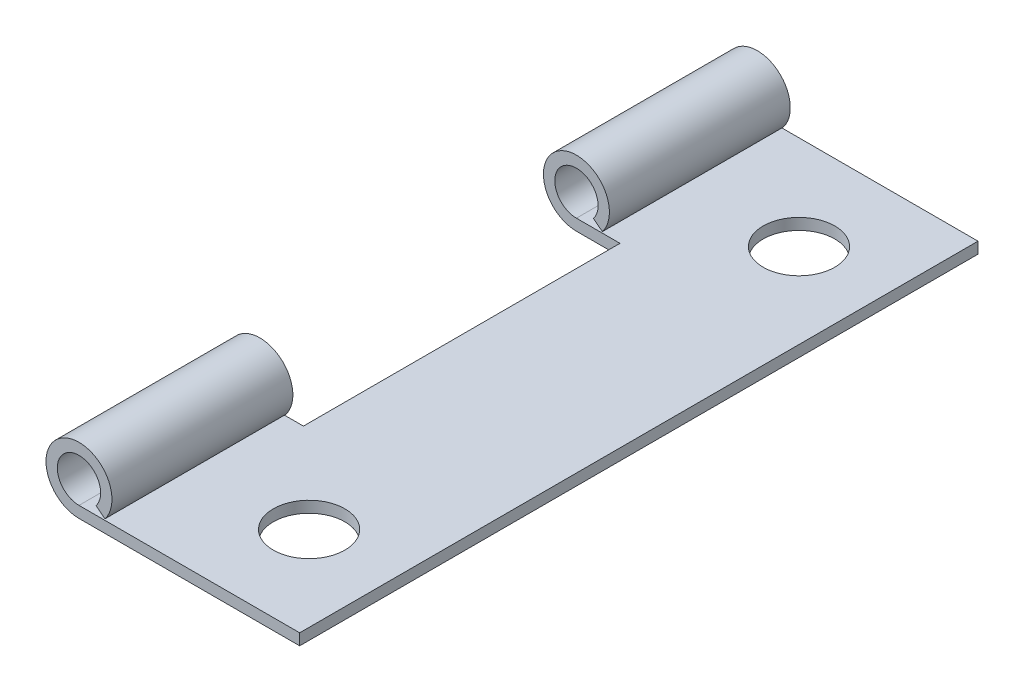
ISO-10303-21;
HEADER;
FILE_DESCRIPTION(('STEP AP214'),'2;1');
FILE_NAME('part.step','',(''),(''),'','','');
FILE_SCHEMA(('AUTOMOTIVE_DESIGN { 1 0 10303 214 1 1 1 1 }'));
ENDSEC;
DATA;
#1=APPLICATION_CONTEXT('core data for automotive mechanical design processes');
#2=APPLICATION_PROTOCOL_DEFINITION('international standard','automotive_design',2000,#1);
#3=PRODUCT_CONTEXT('',#1,'mechanical');
#4=PRODUCT('Part','Part','',(#3));
#5=PRODUCT_RELATED_PRODUCT_CATEGORY('part','',(#4));
#6=PRODUCT_DEFINITION_FORMATION('','',#4);
#7=PRODUCT_DEFINITION_CONTEXT('part definition',#1,'design');
#8=PRODUCT_DEFINITION('design','',#6,#7);
#9=PRODUCT_DEFINITION_SHAPE('','',#8);
#10=(LENGTH_UNIT() NAMED_UNIT(*) SI_UNIT(.MILLI.,.METRE.));
#11=(NAMED_UNIT(*) PLANE_ANGLE_UNIT() SI_UNIT($,.RADIAN.));
#12=(NAMED_UNIT(*) SI_UNIT($,.STERADIAN.) SOLID_ANGLE_UNIT());
#13=UNCERTAINTY_MEASURE_WITH_UNIT(LENGTH_MEASURE(1.E-05),#10,'distance_accuracy_value','');
#14=(GEOMETRIC_REPRESENTATION_CONTEXT(3) GLOBAL_UNCERTAINTY_ASSIGNED_CONTEXT((#13)) GLOBAL_UNIT_ASSIGNED_CONTEXT((#10,
#11,#12)) REPRESENTATION_CONTEXT('',''));
#15=CARTESIAN_POINT('',(0.,0.,0.));
#16=DIRECTION('',(0.,0.,1.));
#17=DIRECTION('',(1.,0.,0.));
#18=AXIS2_PLACEMENT_3D('',#15,#16,#17);
#19=CARTESIAN_POINT('',(-11.7121381015996,1.75,36.));
#20=DIRECTION('',(0.,0.,-1.));
#21=DIRECTION('',(-1.,0.,0.));
#22=AXIS2_PLACEMENT_3D('',#19,#20,#21);
#23=CYLINDRICAL_SURFACE('',#22,1.15);
#24=DIRECTION('',(0.,0.,-1.));
#25=VECTOR('',#24,1.);
#26=CARTESIAN_POINT('',(-11.7121381015996,0.600000000000001,36.));
#27=LINE('',#26,#25);
#28=CARTESIAN_POINT('',(-11.7121381015996,0.600000000000001,36.));
#29=VERTEX_POINT('',#28);
#30=CARTESIAN_POINT('',(-11.7121381015996,0.600000000000001,26.4));
#31=VERTEX_POINT('',#30);
#32=EDGE_CURVE('E148',#29,#31,#27,.T.);
#33=ORIENTED_EDGE('',*,*,#32,.T.);
#34=CARTESIAN_POINT('',(-11.7121381015996,1.75,26.4));
#35=DIRECTION('',(0.,0.,1.));
#36=DIRECTION('',(1.,0.,0.));
#37=AXIS2_PLACEMENT_3D('',#34,#35,#36);
#38=CIRCLE('',#37,1.15);
#39=CARTESIAN_POINT('',(-10.8073046216626,1.04022794251596,26.4));
#40=VERTEX_POINT('',#39);
#41=EDGE_CURVE('E115',#31,#40,#38,.F.);
#42=ORIENTED_EDGE('',*,*,#41,.T.);
#43=DIRECTION('',(0.,0.,-1.));
#44=VECTOR('',#43,1.);
#45=CARTESIAN_POINT('',(-10.8073046216626,1.04022794251596,36.));
#46=LINE('',#45,#44);
#47=CARTESIAN_POINT('',(-10.8073046216626,1.04022794251596,36.));
#48=VERTEX_POINT('',#47);
#49=EDGE_CURVE('E112',#48,#40,#46,.T.);
#50=ORIENTED_EDGE('',*,*,#49,.F.);
#51=CARTESIAN_POINT('',(-11.7121381015996,1.75,36.));
#52=DIRECTION('',(0.,0.,-1.));
#53=DIRECTION('',(-1.,0.,0.));
#54=AXIS2_PLACEMENT_3D('',#51,#52,#53);
#55=CIRCLE('',#54,1.15);
#56=EDGE_CURVE('E98',#29,#48,#55,.T.);
#57=ORIENTED_EDGE('',*,*,#56,.F.);
#58=EDGE_LOOP('',(#33,#42,#50,#57));
#59=FACE_BOUND('',#58,.T.);
#60=ADVANCED_FACE('F32',(#59),#23,.F.);
#61=CARTESIAN_POINT('',(-10.8073046216626,1.04022794251596,36.));
#62=DIRECTION('',(0.617193093464386,0.786811721684332,0.));
#63=DIRECTION('',(-0.786811721684332,0.617193093464386,0.));
#64=AXIS2_PLACEMENT_3D('',#61,#62,#63);
#65=PLANE('',#64);
#66=ORIENTED_EDGE('',*,*,#49,.T.);
#67=DIRECTION('',(0.786811721684332,-0.617193093464386,0.));
#68=VECTOR('',#67,1.);
#69=CARTESIAN_POINT('',(-10.8073046216626,1.04022794251596,26.4));
#70=LINE('',#69,#68);
#71=CARTESIAN_POINT('',(-10.335217588652,0.669912086437324,26.4));
#72=VERTEX_POINT('',#71);
#73=EDGE_CURVE('E200',#40,#72,#70,.T.);
#74=ORIENTED_EDGE('',*,*,#73,.T.);
#75=DIRECTION('',(0.,0.,-1.));
#76=VECTOR('',#75,1.);
#77=CARTESIAN_POINT('',(-10.335217588652,0.669912086437324,36.));
#78=LINE('',#77,#76);
#79=CARTESIAN_POINT('',(-10.335217588652,0.669912086437324,36.));
#80=VERTEX_POINT('',#79);
#81=EDGE_CURVE('E123',#80,#72,#78,.T.);
#82=ORIENTED_EDGE('',*,*,#81,.F.);
#83=DIRECTION('',(0.786811721684332,-0.617193093464386,0.));
#84=VECTOR('',#83,1.);
#85=CARTESIAN_POINT('',(-10.8073046216626,1.04022794251596,36.));
#86=LINE('',#85,#84);
#87=EDGE_CURVE('E102',#48,#80,#86,.T.);
#88=ORIENTED_EDGE('',*,*,#87,.F.);
#89=EDGE_LOOP('',(#66,#74,#82,#88));
#90=FACE_BOUND('',#89,.T.);
#91=ADVANCED_FACE('F121',(#90),#65,.F.);
#92=CARTESIAN_POINT('',(-11.7121381015996,1.75,36.));
#93=DIRECTION('',(0.,0.,-1.));
#94=DIRECTION('',(-1.,0.,0.));
#95=AXIS2_PLACEMENT_3D('',#92,#93,#94);
#96=CYLINDRICAL_SURFACE('',#95,1.75);
#97=CARTESIAN_POINT('',(-11.7121381015996,1.75,9.6));
#98=DIRECTION('',(0.,0.,-1.));
#99=DIRECTION('',(-1.,0.,0.));
#100=AXIS2_PLACEMENT_3D('',#97,#98,#99);
#101=CIRCLE('',#100,1.75);
#102=CARTESIAN_POINT('',(-11.7121381015996,0.,9.6));
#103=VERTEX_POINT('',#102);
#104=CARTESIAN_POINT('',(-10.335217588652,0.669912086437324,9.6));
#105=VERTEX_POINT('',#104);
#106=EDGE_CURVE('E155',#103,#105,#101,.T.);
#107=ORIENTED_EDGE('',*,*,#106,.T.);
#108=CARTESIAN_POINT('',(-10.335217588652,0.669912086437324,0.));
#109=VERTEX_POINT('',#108);
#110=EDGE_CURVE('E73',#105,#109,#78,.T.);
#111=ORIENTED_EDGE('',*,*,#110,.T.);
#112=CARTESIAN_POINT('',(-11.7121381015996,1.75,0.));
#113=DIRECTION('',(0.,0.,1.));
#114=DIRECTION('',(-1.,0.,0.));
#115=AXIS2_PLACEMENT_3D('',#112,#113,#114);
#116=CIRCLE('',#115,1.75);
#117=CARTESIAN_POINT('',(-11.7121381015996,0.,0.));
#118=VERTEX_POINT('',#117);
#119=EDGE_CURVE('E141',#109,#118,#116,.T.);
#120=ORIENTED_EDGE('',*,*,#119,.T.);
#121=DIRECTION('',(0.,0.,-1.));
#122=VECTOR('',#121,1.);
#123=CARTESIAN_POINT('',(-11.7121381015996,0.,36.));
#124=LINE('',#123,#122);
#125=EDGE_CURVE('E81',#103,#118,#124,.T.);
#126=ORIENTED_EDGE('',*,*,#125,.F.);
#127=EDGE_LOOP('',(#107,#111,#120,#126));
#128=FACE_BOUND('',#127,.T.);
#129=ADVANCED_FACE('F245',(#128),#96,.T.);
#130=CARTESIAN_POINT('',(-11.7121381015996,0.,36.));
#131=DIRECTION('',(0.,1.,0.));
#132=DIRECTION('',(0.,0.,1.));
#133=AXIS2_PLACEMENT_3D('',#130,#131,#132);
#134=PLANE('',#133);
#135=CARTESIAN_POINT('',(-4.50000000000001,0.,5.));
#136=DIRECTION('',(0.,1.,0.));
#137=DIRECTION('',(-1.,0.,0.));
#138=AXIS2_PLACEMENT_3D('',#135,#136,#137);
#139=CIRCLE('',#138,1.9);
#140=CARTESIAN_POINT('',(-6.40000000000001,0.,5.));
#141=VERTEX_POINT('',#140);
#142=EDGE_CURVE('E131',#141,#141,#139,.T.);
#143=ORIENTED_EDGE('',*,*,#142,.T.);
#144=EDGE_LOOP('',(#143));
#145=FACE_BOUND('',#144,.T.);
#146=CARTESIAN_POINT('',(-4.50000000000001,0.,31.));
#147=DIRECTION('',(0.,1.,0.));
#148=DIRECTION('',(1.,0.,0.));
#149=AXIS2_PLACEMENT_3D('',#146,#147,#148);
#150=CIRCLE('',#149,1.9);
#151=CARTESIAN_POINT('',(-6.40000000000001,0.,31.));
#152=VERTEX_POINT('',#151);
#153=EDGE_CURVE('E188',#152,#152,#150,.T.);
#154=ORIENTED_EDGE('',*,*,#153,.T.);
#155=EDGE_LOOP('',(#154));
#156=FACE_BOUND('',#155,.T.);
#157=CARTESIAN_POINT('',(-11.7121381015996,0.,36.));
#158=VERTEX_POINT('',#157);
#159=CARTESIAN_POINT('',(-11.7121381015996,0.,26.4));
#160=VERTEX_POINT('',#159);
#161=EDGE_CURVE('E144',#158,#160,#124,.T.);
#162=ORIENTED_EDGE('',*,*,#161,.T.);
#163=DIRECTION('',(1.,0.,0.));
#164=VECTOR('',#163,1.);
#165=CARTESIAN_POINT('',(-17.5242762031992,0.,26.4));
#166=LINE('',#165,#164);
#167=CARTESIAN_POINT('',(-9.4,0.,26.4));
#168=VERTEX_POINT('',#167);
#169=EDGE_CURVE('E171',#160,#168,#166,.T.);
#170=ORIENTED_EDGE('',*,*,#169,.T.);
#171=DIRECTION('',(0.,0.,-1.));
#172=VECTOR('',#171,1.);
#173=CARTESIAN_POINT('',(-9.4,0.,9.6));
#174=LINE('',#173,#172);
#175=CARTESIAN_POINT('',(-9.4,0.,9.6));
#176=VERTEX_POINT('',#175);
#177=EDGE_CURVE('E215',#168,#176,#174,.T.);
#178=ORIENTED_EDGE('',*,*,#177,.T.);
#179=DIRECTION('',(-1.,0.,0.));
#180=VECTOR('',#179,1.);
#181=CARTESIAN_POINT('',(-17.5242762031992,0.,9.6));
#182=LINE('',#181,#180);
#183=EDGE_CURVE('E179',#176,#103,#182,.T.);
#184=ORIENTED_EDGE('',*,*,#183,.T.);
#185=ORIENTED_EDGE('',*,*,#125,.T.);
#186=DIRECTION('',(1.,0.,0.));
#187=VECTOR('',#186,1.);
#188=CARTESIAN_POINT('',(-11.7121381015996,0.,0.));
#189=LINE('',#188,#187);
#190=CARTESIAN_POINT('',(0.,0.,0.));
#191=VERTEX_POINT('',#190);
#192=EDGE_CURVE('E128',#118,#191,#189,.T.);
#193=ORIENTED_EDGE('',*,*,#192,.T.);
#194=DIRECTION('',(0.,0.,-1.));
#195=VECTOR('',#194,1.);
#196=CARTESIAN_POINT('',(0.,0.,36.));
#197=LINE('',#196,#195);
#198=CARTESIAN_POINT('',(0.,0.,36.));
#199=VERTEX_POINT('',#198);
#200=EDGE_CURVE('E153',#199,#191,#197,.T.);
#201=ORIENTED_EDGE('',*,*,#200,.F.);
#202=DIRECTION('',(1.,0.,0.));
#203=VECTOR('',#202,1.);
#204=CARTESIAN_POINT('',(-11.7121381015996,0.,36.));
#205=LINE('',#204,#203);
#206=EDGE_CURVE('E143',#158,#199,#205,.T.);
#207=ORIENTED_EDGE('',*,*,#206,.F.);
#208=EDGE_LOOP('',(#162,#170,#178,#184,#185,#193,#201,#207));
#209=FACE_BOUND('',#208,.T.);
#210=ADVANCED_FACE('F34',(#145,#156,#209),#134,.F.);
#211=CARTESIAN_POINT('',(0.,0.,36.));
#212=DIRECTION('',(-1.,0.,0.));
#213=DIRECTION('',(0.,0.,1.));
#214=AXIS2_PLACEMENT_3D('',#211,#212,#213);
#215=PLANE('',#214);
#216=DIRECTION('',(0.,1.,0.));
#217=VECTOR('',#216,1.);
#218=CARTESIAN_POINT('',(0.,0.,0.));
#219=LINE('',#218,#217);
#220=CARTESIAN_POINT('',(0.,0.6,0.));
#221=VERTEX_POINT('',#220);
#222=EDGE_CURVE('E130',#191,#221,#219,.T.);
#223=ORIENTED_EDGE('',*,*,#222,.T.);
#224=DIRECTION('',(0.,0.,-1.));
#225=VECTOR('',#224,1.);
#226=CARTESIAN_POINT('',(0.,0.6,36.));
#227=LINE('',#226,#225);
#228=CARTESIAN_POINT('',(0.,0.6,36.));
#229=VERTEX_POINT('',#228);
#230=EDGE_CURVE('E150',#229,#221,#227,.T.);
#231=ORIENTED_EDGE('',*,*,#230,.F.);
#232=DIRECTION('',(0.,1.,0.));
#233=VECTOR('',#232,1.);
#234=CARTESIAN_POINT('',(0.,0.,36.));
#235=LINE('',#234,#233);
#236=EDGE_CURVE('E89',#199,#229,#235,.T.);
#237=ORIENTED_EDGE('',*,*,#236,.F.);
#238=ORIENTED_EDGE('',*,*,#200,.T.);
#239=EDGE_LOOP('',(#223,#231,#237,#238));
#240=FACE_BOUND('',#239,.T.);
#241=ADVANCED_FACE('F253',(#240),#215,.F.);
#242=CARTESIAN_POINT('',(0.,0.6,36.));
#243=DIRECTION('',(0.,-1.,0.));
#244=DIRECTION('',(1.,0.,0.));
#245=AXIS2_PLACEMENT_3D('',#242,#243,#244);
#246=PLANE('',#245);
#247=CARTESIAN_POINT('',(-4.50000000000001,0.600000000000001,5.));
#248=DIRECTION('',(0.,1.,0.));
#249=DIRECTION('',(-1.,0.,0.));
#250=AXIS2_PLACEMENT_3D('',#247,#248,#249);
#251=CIRCLE('',#250,1.9);
#252=CARTESIAN_POINT('',(-6.40000000000001,0.600000000000001,5.));
#253=VERTEX_POINT('',#252);
#254=EDGE_CURVE('E192',#253,#253,#251,.T.);
#255=ORIENTED_EDGE('',*,*,#254,.F.);
#256=EDGE_LOOP('',(#255));
#257=FACE_BOUND('',#256,.T.);
#258=CARTESIAN_POINT('',(-4.50000000000001,0.600000000000001,31.));
#259=DIRECTION('',(0.,1.,0.));
#260=DIRECTION('',(1.,0.,0.));
#261=AXIS2_PLACEMENT_3D('',#258,#259,#260);
#262=CIRCLE('',#261,1.9);
#263=CARTESIAN_POINT('',(-6.40000000000001,0.600000000000001,31.));
#264=VERTEX_POINT('',#263);
#265=EDGE_CURVE('E185',#264,#264,#262,.T.);
#266=ORIENTED_EDGE('',*,*,#265,.F.);
#267=EDGE_LOOP('',(#266));
#268=FACE_BOUND('',#267,.T.);
#269=DIRECTION('',(0.,0.,1.));
#270=VECTOR('',#269,1.);
#271=CARTESIAN_POINT('',(-9.4,0.600000000000001,36.));
#272=LINE('',#271,#270);
#273=CARTESIAN_POINT('',(-9.4,0.600000000000001,9.6));
#274=VERTEX_POINT('',#273);
#275=CARTESIAN_POINT('',(-9.4,0.600000000000001,26.4));
#276=VERTEX_POINT('',#275);
#277=EDGE_CURVE('E11',#274,#276,#272,.T.);
#278=ORIENTED_EDGE('',*,*,#277,.T.);
#279=DIRECTION('',(-1.,0.,0.));
#280=VECTOR('',#279,1.);
#281=CARTESIAN_POINT('',(0.,0.6,26.4));
#282=LINE('',#281,#280);
#283=EDGE_CURVE('E189',#276,#31,#282,.T.);
#284=ORIENTED_EDGE('',*,*,#283,.T.);
#285=ORIENTED_EDGE('',*,*,#32,.F.);
#286=DIRECTION('',(-1.,0.,0.));
#287=VECTOR('',#286,1.);
#288=CARTESIAN_POINT('',(0.,0.6,36.));
#289=LINE('',#288,#287);
#290=EDGE_CURVE('E105',#229,#29,#289,.T.);
#291=ORIENTED_EDGE('',*,*,#290,.F.);
#292=ORIENTED_EDGE('',*,*,#230,.T.);
#293=DIRECTION('',(-1.,0.,0.));
#294=VECTOR('',#293,1.);
#295=CARTESIAN_POINT('',(0.,0.6,0.));
#296=LINE('',#295,#294);
#297=CARTESIAN_POINT('',(-11.7121381015996,0.600000000000001,0.));
#298=VERTEX_POINT('',#297);
#299=EDGE_CURVE('E133',#221,#298,#296,.T.);
#300=ORIENTED_EDGE('',*,*,#299,.T.);
#301=CARTESIAN_POINT('',(-11.7121381015996,0.600000000000001,9.6));
#302=VERTEX_POINT('',#301);
#303=EDGE_CURVE('E118',#302,#298,#27,.T.);
#304=ORIENTED_EDGE('',*,*,#303,.F.);
#305=DIRECTION('',(1.,0.,0.));
#306=VECTOR('',#305,1.);
#307=CARTESIAN_POINT('',(0.,0.6,9.6));
#308=LINE('',#307,#306);
#309=EDGE_CURVE('E202',#302,#274,#308,.T.);
#310=ORIENTED_EDGE('',*,*,#309,.T.);
#311=EDGE_LOOP('',(#278,#284,#285,#291,#292,#300,#304,#310));
#312=FACE_BOUND('',#311,.T.);
#313=ADVANCED_FACE('F240',(#257,#268,#312),#246,.F.);
#314=CARTESIAN_POINT('',(-10.8073046216626,1.04022794251596,9.6));
#315=VERTEX_POINT('',#314);
#316=CARTESIAN_POINT('',(-10.8073046216626,1.04022794251596,0.));
#317=VERTEX_POINT('',#316);
#318=EDGE_CURVE('E119',#315,#317,#46,.T.);
#319=ORIENTED_EDGE('',*,*,#318,.F.);
#320=CARTESIAN_POINT('',(-11.7121381015996,1.75,9.6));
#321=DIRECTION('',(0.,0.,-1.));
#322=DIRECTION('',(-1.,0.,0.));
#323=AXIS2_PLACEMENT_3D('',#320,#321,#322);
#324=CIRCLE('',#323,1.15);
#325=EDGE_CURVE('E205',#315,#302,#324,.F.);
#326=ORIENTED_EDGE('',*,*,#325,.T.);
#327=ORIENTED_EDGE('',*,*,#303,.T.);
#328=CARTESIAN_POINT('',(-11.7121381015996,1.75,0.));
#329=DIRECTION('',(0.,0.,-1.));
#330=DIRECTION('',(-1.,0.,0.));
#331=AXIS2_PLACEMENT_3D('',#328,#329,#330);
#332=CIRCLE('',#331,1.15);
#333=EDGE_CURVE('E136',#298,#317,#332,.T.);
#334=ORIENTED_EDGE('',*,*,#333,.T.);
#335=EDGE_LOOP('',(#319,#326,#327,#334));
#336=FACE_BOUND('',#335,.T.);
#337=ADVANCED_FACE('F259',(#336),#23,.F.);
#338=ORIENTED_EDGE('',*,*,#110,.F.);
#339=DIRECTION('',(-0.786811721684332,0.617193093464386,0.));
#340=VECTOR('',#339,1.);
#341=CARTESIAN_POINT('',(-10.8073046216626,1.04022794251596,9.6));
#342=LINE('',#341,#340);
#343=EDGE_CURVE('E208',#105,#315,#342,.T.);
#344=ORIENTED_EDGE('',*,*,#343,.T.);
#345=ORIENTED_EDGE('',*,*,#318,.T.);
#346=DIRECTION('',(0.786811721684332,-0.617193093464386,0.));
#347=VECTOR('',#346,1.);
#348=CARTESIAN_POINT('',(-10.8073046216626,1.04022794251596,0.));
#349=LINE('',#348,#347);
#350=EDGE_CURVE('E139',#317,#109,#349,.T.);
#351=ORIENTED_EDGE('',*,*,#350,.T.);
#352=EDGE_LOOP('',(#338,#344,#345,#351));
#353=FACE_BOUND('',#352,.T.);
#354=ADVANCED_FACE('F269',(#353),#65,.F.);
#355=CARTESIAN_POINT('',(-11.7121381015996,1.75,26.4));
#356=DIRECTION('',(0.,0.,1.));
#357=DIRECTION('',(1.,0.,0.));
#358=AXIS2_PLACEMENT_3D('',#355,#356,#357);
#359=CIRCLE('',#358,1.75);
#360=EDGE_CURVE('E41',#72,#160,#359,.T.);
#361=ORIENTED_EDGE('',*,*,#360,.T.);
#362=ORIENTED_EDGE('',*,*,#161,.F.);
#363=CARTESIAN_POINT('',(-11.7121381015996,1.75,36.));
#364=DIRECTION('',(0.,0.,1.));
#365=DIRECTION('',(-1.,0.,0.));
#366=AXIS2_PLACEMENT_3D('',#363,#364,#365);
#367=CIRCLE('',#366,1.75);
#368=EDGE_CURVE('E49',#80,#158,#367,.T.);
#369=ORIENTED_EDGE('',*,*,#368,.F.);
#370=ORIENTED_EDGE('',*,*,#81,.T.);
#371=EDGE_LOOP('',(#361,#362,#369,#370));
#372=FACE_BOUND('',#371,.T.);
#373=ADVANCED_FACE('F161',(#372),#96,.T.);
#374=CARTESIAN_POINT('',(-11.7121381015996,1.75,36.));
#375=DIRECTION('',(0.,0.,-1.));
#376=DIRECTION('',(-1.,0.,0.));
#377=AXIS2_PLACEMENT_3D('',#374,#375,#376);
#378=PLANE('',#377);
#379=ORIENTED_EDGE('',*,*,#206,.T.);
#380=ORIENTED_EDGE('',*,*,#236,.T.);
#381=ORIENTED_EDGE('',*,*,#290,.T.);
#382=ORIENTED_EDGE('',*,*,#56,.T.);
#383=ORIENTED_EDGE('',*,*,#87,.T.);
#384=ORIENTED_EDGE('',*,*,#368,.T.);
#385=EDGE_LOOP('',(#379,#380,#381,#382,#383,#384));
#386=FACE_BOUND('',#385,.T.);
#387=ADVANCED_FACE('F100',(#386),#378,.F.);
#388=CARTESIAN_POINT('',(-11.7121381015996,1.75,0.));
#389=DIRECTION('',(0.,0.,-1.));
#390=DIRECTION('',(-1.,0.,0.));
#391=AXIS2_PLACEMENT_3D('',#388,#389,#390);
#392=PLANE('',#391);
#393=ORIENTED_EDGE('',*,*,#192,.F.);
#394=ORIENTED_EDGE('',*,*,#119,.F.);
#395=ORIENTED_EDGE('',*,*,#350,.F.);
#396=ORIENTED_EDGE('',*,*,#333,.F.);
#397=ORIENTED_EDGE('',*,*,#299,.F.);
#398=ORIENTED_EDGE('',*,*,#222,.F.);
#399=EDGE_LOOP('',(#393,#394,#395,#396,#397,#398));
#400=FACE_BOUND('',#399,.T.);
#401=ADVANCED_FACE('F250',(#400),#392,.T.);
#402=CARTESIAN_POINT('',(-4.50000000000001,0.,31.));
#403=DIRECTION('',(0.,1.,0.));
#404=DIRECTION('',(-1.,0.,0.));
#405=AXIS2_PLACEMENT_3D('',#402,#403,#404);
#406=CYLINDRICAL_SURFACE('',#405,1.9);
#407=CARTESIAN_POINT('',(-6.40000000000001,0.,31.));
#408=CARTESIAN_POINT('',(-6.40000000000001,0.00624999999999882,31.));
#409=CARTESIAN_POINT('',(-6.40000000000001,0.0124999999999988,31.));
#410=CARTESIAN_POINT('',(-6.40000000000001,0.0249999999999989,31.));
#411=CARTESIAN_POINT('',(-6.40000000000001,0.0312499999999989,31.));
#412=CARTESIAN_POINT('',(-6.40000000000001,0.0437499999999989,31.));
#413=CARTESIAN_POINT('',(-6.40000000000001,0.049999999999999,31.));
#414=CARTESIAN_POINT('',(-6.40000000000001,0.062499999999999,31.));
#415=CARTESIAN_POINT('',(-6.40000000000001,0.068749999999999,31.));
#416=CARTESIAN_POINT('',(-6.40000000000001,0.0812499999999991,31.));
#417=CARTESIAN_POINT('',(-6.40000000000001,0.0874999999999991,31.));
#418=CARTESIAN_POINT('',(-6.40000000000001,0.0999999999999991,31.));
#419=CARTESIAN_POINT('',(-6.40000000000001,0.106249999999999,31.));
#420=CARTESIAN_POINT('',(-6.40000000000001,0.118749999999999,31.));
#421=CARTESIAN_POINT('',(-6.40000000000001,0.124999999999999,31.));
#422=CARTESIAN_POINT('',(-6.40000000000001,0.137499999999999,31.));
#423=CARTESIAN_POINT('',(-6.40000000000001,0.143749999999999,31.));
#424=CARTESIAN_POINT('',(-6.40000000000001,0.156249999999999,31.));
#425=CARTESIAN_POINT('',(-6.40000000000001,0.162499999999999,31.));
#426=CARTESIAN_POINT('',(-6.40000000000001,0.174999999999999,31.));
#427=CARTESIAN_POINT('',(-6.40000000000001,0.181249999999999,31.));
#428=CARTESIAN_POINT('',(-6.40000000000001,0.193749999999999,31.));
#429=CARTESIAN_POINT('',(-6.40000000000001,0.199999999999999,31.));
#430=CARTESIAN_POINT('',(-6.40000000000001,0.212499999999999,31.));
#431=CARTESIAN_POINT('',(-6.40000000000001,0.21875,31.));
#432=CARTESIAN_POINT('',(-6.40000000000001,0.23125,31.));
#433=CARTESIAN_POINT('',(-6.40000000000001,0.2375,31.));
#434=CARTESIAN_POINT('',(-6.40000000000001,0.25,31.));
#435=CARTESIAN_POINT('',(-6.40000000000001,0.25625,31.));
#436=CARTESIAN_POINT('',(-6.40000000000001,0.26875,31.));
#437=CARTESIAN_POINT('',(-6.40000000000001,0.275,31.));
#438=CARTESIAN_POINT('',(-6.40000000000001,0.2875,31.));
#439=CARTESIAN_POINT('',(-6.40000000000001,0.29375,31.));
#440=CARTESIAN_POINT('',(-6.40000000000001,0.30625,31.));
#441=CARTESIAN_POINT('',(-6.40000000000001,0.3125,31.));
#442=CARTESIAN_POINT('',(-6.40000000000001,0.325,31.));
#443=CARTESIAN_POINT('',(-6.40000000000001,0.33125,31.));
#444=CARTESIAN_POINT('',(-6.40000000000001,0.34375,31.));
#445=CARTESIAN_POINT('',(-6.40000000000001,0.35,31.));
#446=CARTESIAN_POINT('',(-6.40000000000001,0.3625,31.));
#447=CARTESIAN_POINT('',(-6.40000000000001,0.36875,31.));
#448=CARTESIAN_POINT('',(-6.40000000000001,0.38125,31.));
#449=CARTESIAN_POINT('',(-6.40000000000001,0.3875,31.));
#450=CARTESIAN_POINT('',(-6.40000000000001,0.4,31.));
#451=CARTESIAN_POINT('',(-6.40000000000001,0.40625,31.));
#452=CARTESIAN_POINT('',(-6.40000000000001,0.41875,31.));
#453=CARTESIAN_POINT('',(-6.40000000000001,0.425,31.));
#454=CARTESIAN_POINT('',(-6.40000000000001,0.4375,31.));
#455=CARTESIAN_POINT('',(-6.40000000000001,0.44375,31.));
#456=CARTESIAN_POINT('',(-6.40000000000001,0.45625,31.));
#457=CARTESIAN_POINT('',(-6.40000000000001,0.4625,31.));
#458=CARTESIAN_POINT('',(-6.40000000000001,0.475,31.));
#459=CARTESIAN_POINT('',(-6.40000000000001,0.48125,31.));
#460=CARTESIAN_POINT('',(-6.40000000000001,0.49375,31.));
#461=CARTESIAN_POINT('',(-6.40000000000001,0.5,31.));
#462=CARTESIAN_POINT('',(-6.40000000000001,0.512500000000001,31.));
#463=CARTESIAN_POINT('',(-6.40000000000001,0.51875,31.));
#464=CARTESIAN_POINT('',(-6.40000000000001,0.53125,31.));
#465=CARTESIAN_POINT('',(-6.40000000000001,0.537500000000001,31.));
#466=CARTESIAN_POINT('',(-6.40000000000001,0.550000000000001,31.));
#467=CARTESIAN_POINT('',(-6.40000000000001,0.556250000000001,31.));
#468=CARTESIAN_POINT('',(-6.40000000000001,0.568750000000001,31.));
#469=CARTESIAN_POINT('',(-6.40000000000001,0.575000000000001,31.));
#470=CARTESIAN_POINT('',(-6.40000000000001,0.587500000000001,31.));
#471=CARTESIAN_POINT('',(-6.40000000000001,0.593750000000001,31.));
#472=CARTESIAN_POINT('',(-6.40000000000001,0.600000000000001,31.));
#473=B_SPLINE_CURVE_WITH_KNOTS('',3,(#407,#408,#409,#410,#411,#412,#413,#414,#415,#416,#417,
#418,#419,#420,#421,#422,#423,#424,#425,#426,#427,#428,#429,#430,#431,#432,#433,#434,#435,#436,
#437,#438,#439,#440,#441,#442,#443,#444,#445,#446,#447,#448,#449,#450,#451,#452,#453,#454,#455,
#456,#457,#458,#459,#460,#461,#462,#463,#464,#465,#466,#467,#468,#469,#470,#471,#472),
.UNSPECIFIED.,.F.,.F.,(4,2,2,2,2,2,2,2,2,2,2,2,2,2,2,2,2,2,2,2,2,2,2,2,2,2,2,2,2,2,2,2,4),(0.,
0.0187500000000001,0.0375000000000001,0.0562500000000002,0.0750000000000002,0.0937500000000003,
0.1125,0.13125,0.15,0.168750000000001,0.187500000000001,0.206250000000001,0.225000000000001,
0.243750000000001,0.262500000000001,0.281250000000001,0.300000000000001,0.318750000000001,
0.337500000000001,0.356250000000001,0.375000000000001,0.393750000000001,0.412500000000001,
0.431250000000001,0.450000000000002,0.468750000000002,0.487500000000002,0.506250000000002,
0.525000000000002,0.543750000000002,0.562500000000002,0.581250000000002,0.600000000000002),.UNSPECIFIED.);
#474=EDGE_CURVE('BSEAM284',#152,#264,#473,.T.);
#475=ORIENTED_EDGE('',*,*,#153,.F.);
#476=ORIENTED_EDGE('',*,*,#265,.T.);
#477=ORIENTED_EDGE('',*,*,#474,.T.);
#478=ORIENTED_EDGE('',*,*,#474,.F.);
#479=EDGE_LOOP('',(#475,#477,#476,#478));
#480=FACE_BOUND('',#479,.T.);
#481=ADVANCED_FACE('F284',(#480),#406,.F.);
#482=CARTESIAN_POINT('',(-4.50000000000001,0.,5.));
#483=DIRECTION('',(0.,1.,0.));
#484=DIRECTION('',(-1.,0.,0.));
#485=AXIS2_PLACEMENT_3D('',#482,#483,#484);
#486=CYLINDRICAL_SURFACE('',#485,1.9);
#487=CARTESIAN_POINT('',(-6.40000000000001,0.,5.));
#488=CARTESIAN_POINT('',(-6.40000000000001,0.00624999999999882,5.));
#489=CARTESIAN_POINT('',(-6.40000000000001,0.0124999999999988,5.));
#490=CARTESIAN_POINT('',(-6.40000000000001,0.0249999999999989,5.));
#491=CARTESIAN_POINT('',(-6.40000000000001,0.0312499999999989,5.));
#492=CARTESIAN_POINT('',(-6.40000000000001,0.0437499999999989,5.));
#493=CARTESIAN_POINT('',(-6.40000000000001,0.049999999999999,5.));
#494=CARTESIAN_POINT('',(-6.40000000000001,0.062499999999999,5.));
#495=CARTESIAN_POINT('',(-6.40000000000001,0.068749999999999,5.));
#496=CARTESIAN_POINT('',(-6.40000000000001,0.0812499999999991,5.));
#497=CARTESIAN_POINT('',(-6.40000000000001,0.0874999999999991,5.));
#498=CARTESIAN_POINT('',(-6.40000000000001,0.0999999999999991,5.));
#499=CARTESIAN_POINT('',(-6.40000000000001,0.106249999999999,5.));
#500=CARTESIAN_POINT('',(-6.40000000000001,0.118749999999999,5.));
#501=CARTESIAN_POINT('',(-6.40000000000001,0.124999999999999,5.));
#502=CARTESIAN_POINT('',(-6.40000000000001,0.137499999999999,5.));
#503=CARTESIAN_POINT('',(-6.40000000000001,0.143749999999999,5.));
#504=CARTESIAN_POINT('',(-6.40000000000001,0.156249999999999,5.));
#505=CARTESIAN_POINT('',(-6.40000000000001,0.162499999999999,5.));
#506=CARTESIAN_POINT('',(-6.40000000000001,0.174999999999999,5.));
#507=CARTESIAN_POINT('',(-6.40000000000001,0.181249999999999,5.));
#508=CARTESIAN_POINT('',(-6.40000000000001,0.193749999999999,5.));
#509=CARTESIAN_POINT('',(-6.40000000000001,0.199999999999999,5.));
#510=CARTESIAN_POINT('',(-6.40000000000001,0.212499999999999,5.));
#511=CARTESIAN_POINT('',(-6.40000000000001,0.21875,5.));
#512=CARTESIAN_POINT('',(-6.40000000000001,0.23125,5.));
#513=CARTESIAN_POINT('',(-6.40000000000001,0.2375,5.));
#514=CARTESIAN_POINT('',(-6.40000000000001,0.25,5.));
#515=CARTESIAN_POINT('',(-6.40000000000001,0.25625,5.));
#516=CARTESIAN_POINT('',(-6.40000000000001,0.26875,5.));
#517=CARTESIAN_POINT('',(-6.40000000000001,0.275,5.));
#518=CARTESIAN_POINT('',(-6.40000000000001,0.2875,5.));
#519=CARTESIAN_POINT('',(-6.40000000000001,0.29375,5.));
#520=CARTESIAN_POINT('',(-6.40000000000001,0.30625,5.));
#521=CARTESIAN_POINT('',(-6.40000000000001,0.3125,5.));
#522=CARTESIAN_POINT('',(-6.40000000000001,0.325,5.));
#523=CARTESIAN_POINT('',(-6.40000000000001,0.33125,5.));
#524=CARTESIAN_POINT('',(-6.40000000000001,0.34375,5.));
#525=CARTESIAN_POINT('',(-6.40000000000001,0.35,5.));
#526=CARTESIAN_POINT('',(-6.40000000000001,0.3625,5.));
#527=CARTESIAN_POINT('',(-6.40000000000001,0.36875,5.));
#528=CARTESIAN_POINT('',(-6.40000000000001,0.38125,5.));
#529=CARTESIAN_POINT('',(-6.40000000000001,0.3875,5.));
#530=CARTESIAN_POINT('',(-6.40000000000001,0.4,5.));
#531=CARTESIAN_POINT('',(-6.40000000000001,0.40625,5.));
#532=CARTESIAN_POINT('',(-6.40000000000001,0.41875,5.));
#533=CARTESIAN_POINT('',(-6.40000000000001,0.425,5.));
#534=CARTESIAN_POINT('',(-6.40000000000001,0.4375,5.));
#535=CARTESIAN_POINT('',(-6.40000000000001,0.44375,5.));
#536=CARTESIAN_POINT('',(-6.40000000000001,0.45625,5.));
#537=CARTESIAN_POINT('',(-6.40000000000001,0.4625,5.));
#538=CARTESIAN_POINT('',(-6.40000000000001,0.475,5.));
#539=CARTESIAN_POINT('',(-6.40000000000001,0.48125,5.));
#540=CARTESIAN_POINT('',(-6.40000000000001,0.49375,5.));
#541=CARTESIAN_POINT('',(-6.40000000000001,0.5,5.));
#542=CARTESIAN_POINT('',(-6.40000000000001,0.512500000000001,5.));
#543=CARTESIAN_POINT('',(-6.40000000000001,0.51875,5.));
#544=CARTESIAN_POINT('',(-6.40000000000001,0.53125,5.));
#545=CARTESIAN_POINT('',(-6.40000000000001,0.537500000000001,5.));
#546=CARTESIAN_POINT('',(-6.40000000000001,0.550000000000001,5.));
#547=CARTESIAN_POINT('',(-6.40000000000001,0.556250000000001,5.));
#548=CARTESIAN_POINT('',(-6.40000000000001,0.568750000000001,5.));
#549=CARTESIAN_POINT('',(-6.40000000000001,0.575000000000001,5.));
#550=CARTESIAN_POINT('',(-6.40000000000001,0.587500000000001,5.));
#551=CARTESIAN_POINT('',(-6.40000000000001,0.593750000000001,5.));
#552=CARTESIAN_POINT('',(-6.40000000000001,0.600000000000001,5.));
#553=B_SPLINE_CURVE_WITH_KNOTS('',3,(#487,#488,#489,#490,#491,#492,#493,#494,#495,#496,#497,
#498,#499,#500,#501,#502,#503,#504,#505,#506,#507,#508,#509,#510,#511,#512,#513,#514,#515,#516,
#517,#518,#519,#520,#521,#522,#523,#524,#525,#526,#527,#528,#529,#530,#531,#532,#533,#534,#535,
#536,#537,#538,#539,#540,#541,#542,#543,#544,#545,#546,#547,#548,#549,#550,#551,#552),
.UNSPECIFIED.,.F.,.F.,(4,2,2,2,2,2,2,2,2,2,2,2,2,2,2,2,2,2,2,2,2,2,2,2,2,2,2,2,2,2,2,2,4),(0.,
0.0187500000000001,0.0375000000000001,0.0562500000000002,0.0750000000000002,0.0937500000000003,
0.1125,0.13125,0.15,0.168750000000001,0.187500000000001,0.206250000000001,0.225000000000001,
0.243750000000001,0.262500000000001,0.281250000000001,0.300000000000001,0.318750000000001,
0.337500000000001,0.356250000000001,0.375000000000001,0.393750000000001,0.412500000000001,
0.431250000000001,0.450000000000002,0.468750000000002,0.487500000000002,0.506250000000002,
0.525000000000002,0.543750000000002,0.562500000000002,0.581250000000002,0.600000000000002),.UNSPECIFIED.);
#554=EDGE_CURVE('BSEAM289',#141,#253,#553,.T.);
#555=ORIENTED_EDGE('',*,*,#142,.F.);
#556=ORIENTED_EDGE('',*,*,#254,.T.);
#557=ORIENTED_EDGE('',*,*,#554,.T.);
#558=ORIENTED_EDGE('',*,*,#554,.F.);
#559=EDGE_LOOP('',(#555,#557,#556,#558));
#560=FACE_BOUND('',#559,.T.);
#561=ADVANCED_FACE('F289',(#560),#486,.F.);
#562=CARTESIAN_POINT('',(-9.4,0.,9.6));
#563=DIRECTION('',(1.,0.,0.));
#564=DIRECTION('',(0.,1.,0.));
#565=AXIS2_PLACEMENT_3D('',#562,#563,#564);
#566=PLANE('',#565);
#567=DIRECTION('',(0.,1.,0.));
#568=VECTOR('',#567,1.);
#569=CARTESIAN_POINT('',(-9.4,0.,9.6));
#570=LINE('',#569,#568);
#571=EDGE_CURVE('E178',#176,#274,#570,.T.);
#572=ORIENTED_EDGE('',*,*,#571,.F.);
#573=ORIENTED_EDGE('',*,*,#177,.F.);
#574=DIRECTION('',(0.,1.,0.));
#575=VECTOR('',#574,1.);
#576=CARTESIAN_POINT('',(-9.4,0.,26.4));
#577=LINE('',#576,#575);
#578=EDGE_CURVE('E175',#168,#276,#577,.T.);
#579=ORIENTED_EDGE('',*,*,#578,.T.);
#580=ORIENTED_EDGE('',*,*,#277,.F.);
#581=EDGE_LOOP('',(#572,#573,#579,#580));
#582=FACE_BOUND('',#581,.T.);
#583=ADVANCED_FACE('F221',(#582),#566,.F.);
#584=CARTESIAN_POINT('',(-17.5242762031992,0.,26.4));
#585=DIRECTION('',(0.,0.,1.));
#586=DIRECTION('',(1.,0.,0.));
#587=AXIS2_PLACEMENT_3D('',#584,#585,#586);
#588=PLANE('',#587);
#589=ORIENTED_EDGE('',*,*,#578,.F.);
#590=ORIENTED_EDGE('',*,*,#169,.F.);
#591=ORIENTED_EDGE('',*,*,#360,.F.);
#592=ORIENTED_EDGE('',*,*,#73,.F.);
#593=ORIENTED_EDGE('',*,*,#41,.F.);
#594=ORIENTED_EDGE('',*,*,#283,.F.);
#595=EDGE_LOOP('',(#589,#590,#591,#592,#593,#594));
#596=FACE_BOUND('',#595,.T.);
#597=ADVANCED_FACE('F172',(#596),#588,.F.);
#598=CARTESIAN_POINT('',(-17.5242762031992,0.,9.6));
#599=DIRECTION('',(0.,0.,-1.));
#600=DIRECTION('',(-1.,0.,0.));
#601=AXIS2_PLACEMENT_3D('',#598,#599,#600);
#602=PLANE('',#601);
#603=ORIENTED_EDGE('',*,*,#325,.F.);
#604=ORIENTED_EDGE('',*,*,#343,.F.);
#605=ORIENTED_EDGE('',*,*,#106,.F.);
#606=ORIENTED_EDGE('',*,*,#183,.F.);
#607=ORIENTED_EDGE('',*,*,#571,.T.);
#608=ORIENTED_EDGE('',*,*,#309,.F.);
#609=EDGE_LOOP('',(#603,#604,#605,#606,#607,#608));
#610=FACE_BOUND('',#609,.T.);
#611=ADVANCED_FACE('F243',(#610),#602,.F.);
#612=CLOSED_SHELL('',(#60,#91,#129,#210,#241,#313,#337,#354,#373,#387,#401,#481,#561,#583,#597,#611));
#613=MANIFOLD_SOLID_BREP('B2',#612);
#614=ADVANCED_BREP_SHAPE_REPRESENTATION('',(#18,#613),#14);
#615=SHAPE_DEFINITION_REPRESENTATION(#9,#614);
ENDSEC;
END-ISO-10303-21;
